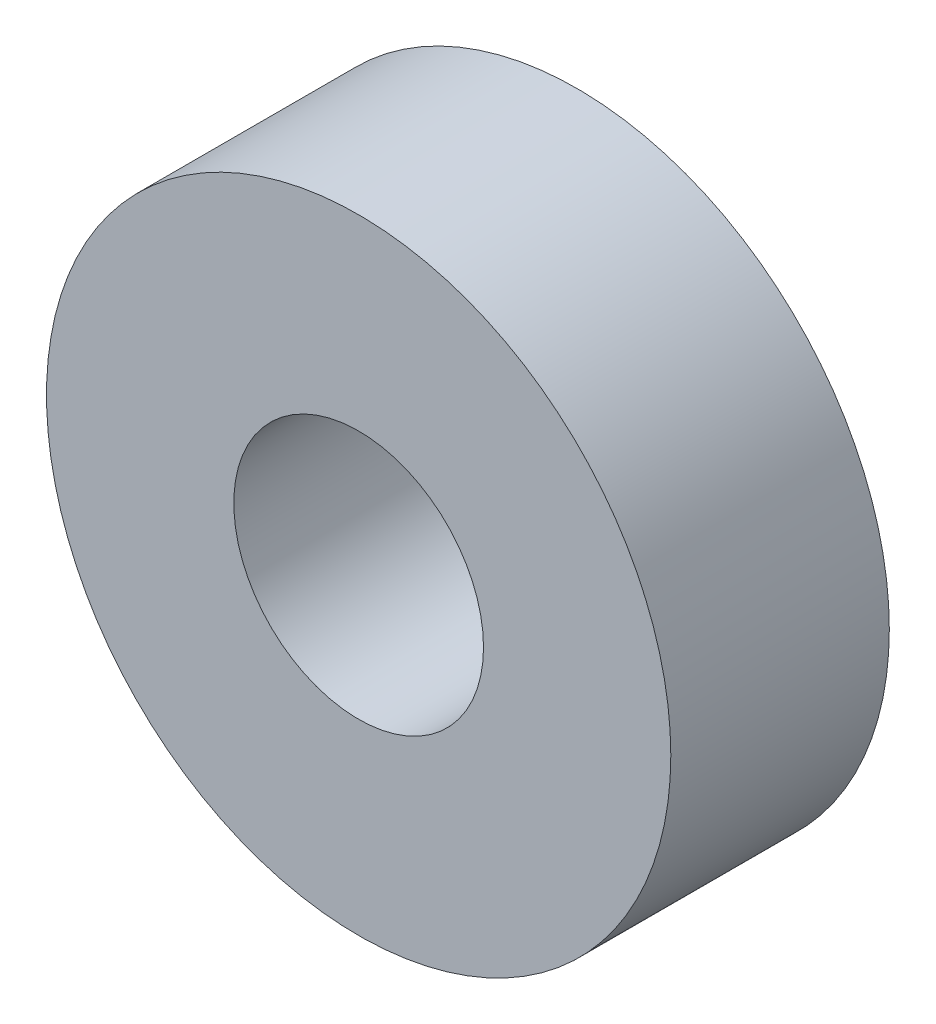
ISO-10303-21;
HEADER;
FILE_DESCRIPTION(('STEP AP214'),'2;1');
FILE_NAME('part.step','',(''),(''),'','','');
FILE_SCHEMA(('AUTOMOTIVE_DESIGN { 1 0 10303 214 1 1 1 1 }'));
ENDSEC;
DATA;
#1=APPLICATION_CONTEXT('core data for automotive mechanical design processes');
#2=APPLICATION_PROTOCOL_DEFINITION('international standard','automotive_design',2000,#1);
#3=PRODUCT_CONTEXT('',#1,'mechanical');
#4=PRODUCT('Part','Part','',(#3));
#5=PRODUCT_RELATED_PRODUCT_CATEGORY('part','',(#4));
#6=PRODUCT_DEFINITION_FORMATION('','',#4);
#7=PRODUCT_DEFINITION_CONTEXT('part definition',#1,'design');
#8=PRODUCT_DEFINITION('design','',#6,#7);
#9=PRODUCT_DEFINITION_SHAPE('','',#8);
#10=(LENGTH_UNIT() NAMED_UNIT(*) SI_UNIT(.MILLI.,.METRE.));
#11=(NAMED_UNIT(*) PLANE_ANGLE_UNIT() SI_UNIT($,.RADIAN.));
#12=(NAMED_UNIT(*) SI_UNIT($,.STERADIAN.) SOLID_ANGLE_UNIT());
#13=UNCERTAINTY_MEASURE_WITH_UNIT(LENGTH_MEASURE(1.E-05),#10,'distance_accuracy_value','');
#14=(GEOMETRIC_REPRESENTATION_CONTEXT(3) GLOBAL_UNCERTAINTY_ASSIGNED_CONTEXT((#13)) GLOBAL_UNIT_ASSIGNED_CONTEXT((#10,
#11,#12)) REPRESENTATION_CONTEXT('',''));
#15=CARTESIAN_POINT('',(0.,0.,0.));
#16=DIRECTION('',(0.,0.,1.));
#17=DIRECTION('',(1.,0.,0.));
#18=AXIS2_PLACEMENT_3D('',#15,#16,#17);
#19=CARTESIAN_POINT('',(0.,0.,7.));
#20=DIRECTION('',(0.,0.,1.));
#21=DIRECTION('',(1.,0.,0.));
#22=AXIS2_PLACEMENT_3D('',#19,#20,#21);
#23=PLANE('',#22);
#24=CARTESIAN_POINT('',(0.,0.,7.));
#25=DIRECTION('',(0.,0.,1.));
#26=DIRECTION('',(1.,0.,0.));
#27=AXIS2_PLACEMENT_3D('',#24,#25,#26);
#28=CIRCLE('',#27,10.);
#29=CARTESIAN_POINT('',(10.,0.,7.));
#30=VERTEX_POINT('',#29);
#31=EDGE_CURVE('E10',#30,#30,#28,.T.);
#32=ORIENTED_EDGE('',*,*,#31,.T.);
#33=EDGE_LOOP('',(#32));
#34=FACE_BOUND('',#33,.T.);
#35=CARTESIAN_POINT('',(0.,0.,7.));
#36=DIRECTION('',(0.,0.,1.));
#37=DIRECTION('',(1.,0.,0.));
#38=AXIS2_PLACEMENT_3D('',#35,#36,#37);
#39=CIRCLE('',#38,4.);
#40=CARTESIAN_POINT('',(4.,0.,7.));
#41=VERTEX_POINT('',#40);
#42=EDGE_CURVE('E55',#41,#41,#39,.T.);
#43=ORIENTED_EDGE('',*,*,#42,.F.);
#44=EDGE_LOOP('',(#43));
#45=FACE_BOUND('',#44,.T.);
#46=ADVANCED_FACE('F41',(#34,#45),#23,.T.);
#47=CARTESIAN_POINT('',(0.,0.,0.));
#48=DIRECTION('',(0.,0.,1.));
#49=DIRECTION('',(1.,0.,0.));
#50=AXIS2_PLACEMENT_3D('',#47,#48,#49);
#51=PLANE('',#50);
#52=CARTESIAN_POINT('',(0.,0.,0.));
#53=DIRECTION('',(0.,0.,1.));
#54=DIRECTION('',(1.,0.,0.));
#55=AXIS2_PLACEMENT_3D('',#52,#53,#54);
#56=CIRCLE('',#55,10.);
#57=CARTESIAN_POINT('',(10.,0.,0.));
#58=VERTEX_POINT('',#57);
#59=EDGE_CURVE('E44',#58,#58,#56,.T.);
#60=ORIENTED_EDGE('',*,*,#59,.F.);
#61=EDGE_LOOP('',(#60));
#62=FACE_BOUND('',#61,.T.);
#63=CARTESIAN_POINT('',(0.,0.,0.));
#64=DIRECTION('',(0.,0.,1.));
#65=DIRECTION('',(1.,0.,0.));
#66=AXIS2_PLACEMENT_3D('',#63,#64,#65);
#67=CIRCLE('',#66,4.);
#68=CARTESIAN_POINT('',(4.,0.,0.));
#69=VERTEX_POINT('',#68);
#70=EDGE_CURVE('E53',#69,#69,#67,.T.);
#71=ORIENTED_EDGE('',*,*,#70,.T.);
#72=EDGE_LOOP('',(#71));
#73=FACE_BOUND('',#72,.T.);
#74=ADVANCED_FACE('F63',(#62,#73),#51,.F.);
#75=CARTESIAN_POINT('',(0.,0.,7.));
#76=DIRECTION('',(0.,0.,-1.));
#77=DIRECTION('',(-1.,0.,0.));
#78=AXIS2_PLACEMENT_3D('',#75,#76,#77);
#79=CYLINDRICAL_SURFACE('',#78,10.);
#80=ORIENTED_EDGE('',*,*,#31,.F.);
#81=EDGE_LOOP('',(#80));
#82=FACE_BOUND('',#81,.T.);
#83=ORIENTED_EDGE('',*,*,#59,.T.);
#84=EDGE_LOOP('',(#83));
#85=FACE_BOUND('',#84,.T.);
#86=ADVANCED_FACE('F43',(#82,#85),#79,.T.);
#87=CARTESIAN_POINT('',(0.,0.,7.));
#88=DIRECTION('',(0.,0.,-1.));
#89=DIRECTION('',(-1.,0.,0.));
#90=AXIS2_PLACEMENT_3D('',#87,#88,#89);
#91=CYLINDRICAL_SURFACE('',#90,4.);
#92=ORIENTED_EDGE('',*,*,#42,.T.);
#93=EDGE_LOOP('',(#92));
#94=FACE_BOUND('',#93,.T.);
#95=ORIENTED_EDGE('',*,*,#70,.F.);
#96=EDGE_LOOP('',(#95));
#97=FACE_BOUND('',#96,.T.);
#98=ADVANCED_FACE('F58',(#94,#97),#91,.F.);
#99=CLOSED_SHELL('',(#46,#74,#86,#98));
#100=MANIFOLD_SOLID_BREP('B2',#99);
#101=ADVANCED_BREP_SHAPE_REPRESENTATION('',(#18,#100),#14);
#102=SHAPE_DEFINITION_REPRESENTATION(#9,#101);
ENDSEC;
END-ISO-10303-21;
